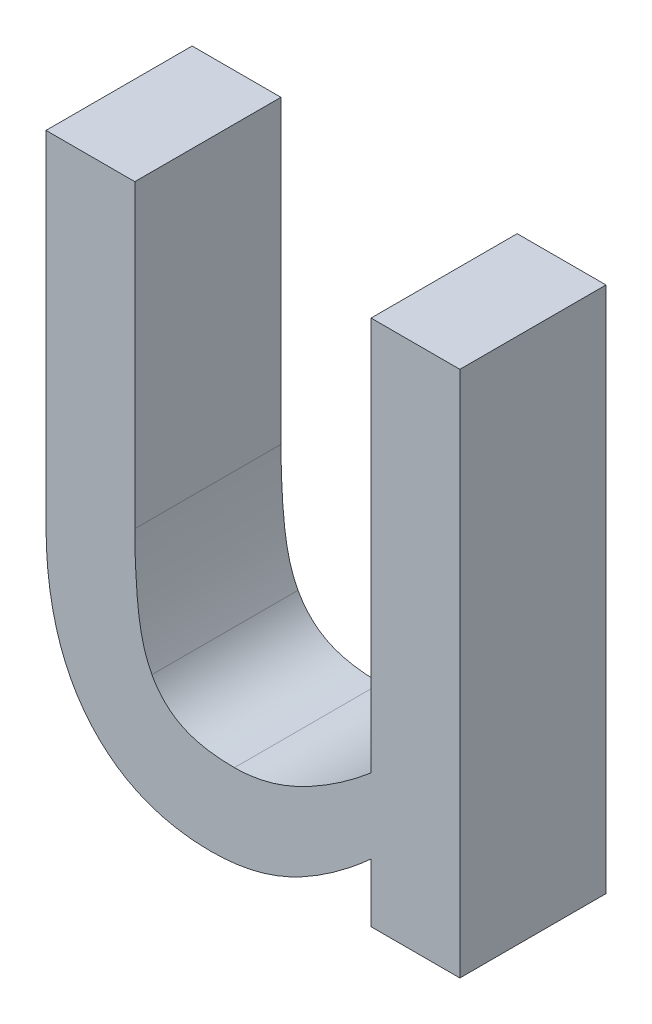
ISO-10303-21;
HEADER;
FILE_DESCRIPTION(('STEP AP214'),'2;1');
FILE_NAME('part.step','',(''),(''),'','','');
FILE_SCHEMA(('AUTOMOTIVE_DESIGN { 1 0 10303 214 1 1 1 1 }'));
ENDSEC;
DATA;
#1=APPLICATION_CONTEXT('core data for automotive mechanical design processes');
#2=APPLICATION_PROTOCOL_DEFINITION('international standard','automotive_design',2000,#1);
#3=PRODUCT_CONTEXT('',#1,'mechanical');
#4=PRODUCT('Part','Part','',(#3));
#5=PRODUCT_RELATED_PRODUCT_CATEGORY('part','',(#4));
#6=PRODUCT_DEFINITION_FORMATION('','',#4);
#7=PRODUCT_DEFINITION_CONTEXT('part definition',#1,'design');
#8=PRODUCT_DEFINITION('design','',#6,#7);
#9=PRODUCT_DEFINITION_SHAPE('','',#8);
#10=(LENGTH_UNIT() NAMED_UNIT(*) SI_UNIT(.MILLI.,.METRE.));
#11=(NAMED_UNIT(*) PLANE_ANGLE_UNIT() SI_UNIT($,.RADIAN.));
#12=(NAMED_UNIT(*) SI_UNIT($,.STERADIAN.) SOLID_ANGLE_UNIT());
#13=UNCERTAINTY_MEASURE_WITH_UNIT(LENGTH_MEASURE(1.E-05),#10,'distance_accuracy_value','');
#14=(GEOMETRIC_REPRESENTATION_CONTEXT(3) GLOBAL_UNCERTAINTY_ASSIGNED_CONTEXT((#13)) GLOBAL_UNIT_ASSIGNED_CONTEXT((#10,
#11,#12)) REPRESENTATION_CONTEXT('',''));
#15=CARTESIAN_POINT('',(0.,0.,0.));
#16=DIRECTION('',(0.,0.,1.));
#17=DIRECTION('',(1.,0.,0.));
#18=AXIS2_PLACEMENT_3D('',#15,#16,#17);
#19=CARTESIAN_POINT('',(-9.781230985172,-7.71259238677,0.));
#20=DIRECTION('',(1.,0.,0.));
#21=DIRECTION('',(0.,1.,0.));
#22=AXIS2_PLACEMENT_3D('',#19,#20,#21);
#23=PLANE('',#22);
#24=DIRECTION('',(0.,-1.,0.));
#25=VECTOR('',#24,1.);
#26=CARTESIAN_POINT('',(-9.781230985172,-7.506899475119,0.));
#27=LINE('',#26,#25);
#28=CARTESIAN_POINT('',(-9.781230985172,-7.506899475119,0.));
#29=VERTEX_POINT('',#28);
#30=CARTESIAN_POINT('',(-9.781230985172,-7.71259238677,0.));
#31=VERTEX_POINT('',#30);
#32=EDGE_CURVE('E11',#29,#31,#27,.T.);
#33=ORIENTED_EDGE('',*,*,#32,.F.);
#34=DIRECTION('',(0.,0.,1.));
#35=VECTOR('',#34,1.);
#36=CARTESIAN_POINT('',(-9.781230985172,-7.506899475119,0.));
#37=LINE('',#36,#35);
#38=CARTESIAN_POINT('',(-9.781230985172,-7.506899475119,0.1));
#39=VERTEX_POINT('',#38);
#40=EDGE_CURVE('E24',#29,#39,#37,.T.);
#41=ORIENTED_EDGE('',*,*,#40,.T.);
#42=DIRECTION('',(0.,1.,0.));
#43=VECTOR('',#42,1.);
#44=CARTESIAN_POINT('',(-9.781230985172,-7.506899475119,0.1));
#45=LINE('',#44,#43);
#46=CARTESIAN_POINT('',(-9.781230985172,-7.71259238677,0.1));
#47=VERTEX_POINT('',#46);
#48=EDGE_CURVE('E130',#47,#39,#45,.T.);
#49=ORIENTED_EDGE('',*,*,#48,.F.);
#50=DIRECTION('',(0.,0.,1.));
#51=VECTOR('',#50,1.);
#52=CARTESIAN_POINT('',(-9.781230985172,-7.71259238677,0.));
#53=LINE('',#52,#51);
#54=EDGE_CURVE('E258',#31,#47,#53,.T.);
#55=ORIENTED_EDGE('',*,*,#54,.F.);
#56=EDGE_LOOP('',(#33,#41,#49,#55));
#57=FACE_BOUND('',#56,.T.);
#58=ADVANCED_FACE('F17',(#57),#23,.T.);
#59=CARTESIAN_POINT('',(-9.769543887919,-7.793233357814,0.));
#60=CARTESIAN_POINT('',(-9.769543887919,-7.793233357814,0.1));
#61=CARTESIAN_POINT('',(-9.77655614627,-7.780377550836,0.));
#62=CARTESIAN_POINT('',(-9.77655614627,-7.780377550836,0.1));
#63=CARTESIAN_POINT('',(-9.781230985172,-7.737524860909,0.));
#64=CARTESIAN_POINT('',(-9.781230985172,-7.737524860909,0.1));
#65=CARTESIAN_POINT('',(-9.781230985172,-7.71259238677,0.));
#66=CARTESIAN_POINT('',(-9.781230985172,-7.71259238677,0.1));
#67=B_SPLINE_SURFACE_WITH_KNOTS('',2,1,((#59,#60),(#61,#62),(#63,#64),(#65,#66)),.UNSPECIFIED.,
.F.,.F.,.F.,(3,1,3),(2,2),(-2.,-1.,0.),(0.,0.01),.UNSPECIFIED.);
#68=CARTESIAN_POINT('',(-9.781230985172,-7.71259238677,0.));
#69=CARTESIAN_POINT('',(-9.781230985172,-7.737524860909,0.));
#70=CARTESIAN_POINT('',(-9.77655614627,-7.780377550836,0.));
#71=CARTESIAN_POINT('',(-9.769543887919,-7.793233357814,0.));
#72=B_SPLINE_CURVE_WITH_KNOTS('',2,(#68,#69,#70,#71),.UNSPECIFIED.,.F.,.F.,(3,1,3),(0.,1.,2.),.UNSPECIFIED.);
#73=CARTESIAN_POINT('',(-9.769543887919,-7.793233357814,0.));
#74=VERTEX_POINT('',#73);
#75=EDGE_CURVE('E251',#31,#74,#72,.T.);
#76=CARTESIAN_POINT('',(-9.769543887919,-7.793233357814,0.1));
#77=CARTESIAN_POINT('',(-9.77655614627,-7.780377550836,0.1));
#78=CARTESIAN_POINT('',(-9.781230985172,-7.737524860909,0.1));
#79=CARTESIAN_POINT('',(-9.781230985172,-7.71259238677,0.1));
#80=B_SPLINE_CURVE_WITH_KNOTS('',2,(#76,#77,#78,#79),.UNSPECIFIED.,.F.,.F.,(3,1,3),(-2.,-1.,0.),.UNSPECIFIED.);
#81=CARTESIAN_POINT('',(-9.769543887919,-7.793233357814,0.1));
#82=VERTEX_POINT('',#81);
#83=EDGE_CURVE('E247',#82,#47,#80,.T.);
#84=DIRECTION('',(0.,0.,1.));
#85=VECTOR('',#84,1.);
#86=CARTESIAN_POINT('',(-9.769543887919,-7.793233357814,0.));
#87=LINE('',#86,#85);
#88=EDGE_CURVE('E241',#74,#82,#87,.T.);
#89=ORIENTED_EDGE('',*,*,#75,.F.);
#90=ORIENTED_EDGE('',*,*,#54,.T.);
#91=ORIENTED_EDGE('',*,*,#83,.F.);
#92=ORIENTED_EDGE('',*,*,#88,.F.);
#93=EDGE_LOOP('',(#89,#90,#91,#92));
#94=FACE_BOUND('',#93,.T.);
#95=ADVANCED_FACE('F303',(#94),#67,.T.);
#96=CARTESIAN_POINT('',(-9.713056251197,-7.820113681496,0.));
#97=CARTESIAN_POINT('',(-9.713056251197,-7.820113681496,0.1));
#98=CARTESIAN_POINT('',(-9.735651305885,-7.820113681496,0.));
#99=CARTESIAN_POINT('',(-9.735651305885,-7.820113681496,0.1));
#100=CARTESIAN_POINT('',(-9.762142059659,-7.806868304609,0.));
#101=CARTESIAN_POINT('',(-9.762142059659,-7.806868304609,0.1));
#102=CARTESIAN_POINT('',(-9.769543887919,-7.793233357814,0.));
#103=CARTESIAN_POINT('',(-9.769543887919,-7.793233357814,0.1));
#104=B_SPLINE_SURFACE_WITH_KNOTS('',2,1,((#96,#97),(#98,#99),(#100,#101),(#102,#103)),
.UNSPECIFIED.,.F.,.F.,.F.,(3,1,3),(2,2),(-2.,-1.,0.),(0.,0.01),.UNSPECIFIED.);
#105=CARTESIAN_POINT('',(-9.769543887919,-7.793233357814,0.));
#106=CARTESIAN_POINT('',(-9.762142059659,-7.806868304609,0.));
#107=CARTESIAN_POINT('',(-9.735651305885,-7.820113681496,0.));
#108=CARTESIAN_POINT('',(-9.713056251197,-7.820113681496,0.));
#109=B_SPLINE_CURVE_WITH_KNOTS('',2,(#105,#106,#107,#108),.UNSPECIFIED.,.F.,.F.,(3,1,3),(0.,1.,
2.),.UNSPECIFIED.);
#110=CARTESIAN_POINT('',(-9.713056251197,-7.820113681496,0.));
#111=VERTEX_POINT('',#110);
#112=EDGE_CURVE('E234',#74,#111,#109,.T.);
#113=CARTESIAN_POINT('',(-9.713056251197,-7.820113681496,0.1));
#114=CARTESIAN_POINT('',(-9.735651305885,-7.820113681496,0.1));
#115=CARTESIAN_POINT('',(-9.762142059659,-7.806868304609,0.1));
#116=CARTESIAN_POINT('',(-9.769543887919,-7.793233357814,0.1));
#117=B_SPLINE_CURVE_WITH_KNOTS('',2,(#113,#114,#115,#116),.UNSPECIFIED.,.F.,.F.,(3,1,3),(-2.,
-1.,0.),.UNSPECIFIED.);
#118=CARTESIAN_POINT('',(-9.713056251197,-7.820113681496,0.1));
#119=VERTEX_POINT('',#118);
#120=EDGE_CURVE('E229',#119,#82,#117,.T.);
#121=DIRECTION('',(0.,0.,1.));
#122=VECTOR('',#121,1.);
#123=CARTESIAN_POINT('',(-9.713056251197,-7.820113681496,0.));
#124=LINE('',#123,#122);
#125=EDGE_CURVE('E223',#111,#119,#124,.T.);
#126=ORIENTED_EDGE('',*,*,#112,.F.);
#127=ORIENTED_EDGE('',*,*,#88,.T.);
#128=ORIENTED_EDGE('',*,*,#120,.F.);
#129=ORIENTED_EDGE('',*,*,#125,.F.);
#130=EDGE_LOOP('',(#126,#127,#128,#129));
#131=FACE_BOUND('',#130,.T.);
#132=ADVANCED_FACE('F299',(#131),#104,.T.);
#133=CARTESIAN_POINT('',(-9.619559473174,-7.776481851752,0.));
#134=CARTESIAN_POINT('',(-9.619559473174,-7.776481851752,0.1));
#135=CARTESIAN_POINT('',(-9.642544097771,-7.795960347173,0.));
#136=CARTESIAN_POINT('',(-9.642544097771,-7.795960347173,0.1));
#137=CARTESIAN_POINT('',(-9.690461196508,-7.820113681496,0.));
#138=CARTESIAN_POINT('',(-9.690461196508,-7.820113681496,0.1));
#139=CARTESIAN_POINT('',(-9.713056251197,-7.820113681496,0.));
#140=CARTESIAN_POINT('',(-9.713056251197,-7.820113681496,0.1));
#141=B_SPLINE_SURFACE_WITH_KNOTS('',2,1,((#133,#134),(#135,#136),(#137,#138),(#139,#140)),
.UNSPECIFIED.,.F.,.F.,.F.,(3,1,3),(2,2),(-2.,-1.,0.),(0.,0.01),.UNSPECIFIED.);
#142=CARTESIAN_POINT('',(-9.713056251197,-7.820113681496,0.));
#143=CARTESIAN_POINT('',(-9.690461196508,-7.820113681496,0.));
#144=CARTESIAN_POINT('',(-9.642544097771,-7.795960347173,0.));
#145=CARTESIAN_POINT('',(-9.619559473174,-7.776481851752,0.));
#146=B_SPLINE_CURVE_WITH_KNOTS('',2,(#142,#143,#144,#145),.UNSPECIFIED.,.F.,.F.,(3,1,3),(0.,1.,
2.),.UNSPECIFIED.);
#147=CARTESIAN_POINT('',(-9.619559473174,-7.776481851752,0.));
#148=VERTEX_POINT('',#147);
#149=EDGE_CURVE('E216',#111,#148,#146,.T.);
#150=CARTESIAN_POINT('',(-9.619559473174,-7.776481851752,0.1));
#151=CARTESIAN_POINT('',(-9.642544097771,-7.795960347173,0.1));
#152=CARTESIAN_POINT('',(-9.690461196508,-7.820113681496,0.1));
#153=CARTESIAN_POINT('',(-9.713056251197,-7.820113681496,0.1));
#154=B_SPLINE_CURVE_WITH_KNOTS('',2,(#150,#151,#152,#153),.UNSPECIFIED.,.F.,.F.,(3,1,3),(-2.,
-1.,0.),.UNSPECIFIED.);
#155=CARTESIAN_POINT('',(-9.619559473174,-7.776481851752,0.1));
#156=VERTEX_POINT('',#155);
#157=EDGE_CURVE('E211',#156,#119,#154,.T.);
#158=DIRECTION('',(0.,0.,1.));
#159=VECTOR('',#158,1.);
#160=CARTESIAN_POINT('',(-9.619559473174,-7.776481851752,0.));
#161=LINE('',#160,#159);
#162=EDGE_CURVE('E208',#148,#156,#161,.T.);
#163=ORIENTED_EDGE('',*,*,#149,.F.);
#164=ORIENTED_EDGE('',*,*,#125,.T.);
#165=ORIENTED_EDGE('',*,*,#157,.F.);
#166=ORIENTED_EDGE('',*,*,#162,.F.);
#167=EDGE_LOOP('',(#163,#164,#165,#166));
#168=FACE_BOUND('',#167,.T.);
#169=ADVANCED_FACE('F295',(#168),#141,.T.);
#170=CARTESIAN_POINT('',(-9.619559473174,-7.506899475119,0.));
#171=DIRECTION('',(-1.,0.,0.));
#172=DIRECTION('',(0.,-1.,0.));
#173=AXIS2_PLACEMENT_3D('',#170,#171,#172);
#174=PLANE('',#173);
#175=DIRECTION('',(0.,1.,0.));
#176=VECTOR('',#175,1.);
#177=CARTESIAN_POINT('',(-9.619559473174,-7.776481851752,0.));
#178=LINE('',#177,#176);
#179=CARTESIAN_POINT('',(-9.619559473174,-7.506899475119,0.));
#180=VERTEX_POINT('',#179);
#181=EDGE_CURVE('E206',#148,#180,#178,.T.);
#182=ORIENTED_EDGE('',*,*,#181,.F.);
#183=ORIENTED_EDGE('',*,*,#162,.T.);
#184=DIRECTION('',(0.,-1.,0.));
#185=VECTOR('',#184,1.);
#186=CARTESIAN_POINT('',(-9.619559473174,-7.776481851752,0.1));
#187=LINE('',#186,#185);
#188=CARTESIAN_POINT('',(-9.619559473174,-7.506899475119,0.1));
#189=VERTEX_POINT('',#188);
#190=EDGE_CURVE('E203',#189,#156,#187,.T.);
#191=ORIENTED_EDGE('',*,*,#190,.F.);
#192=DIRECTION('',(0.,0.,1.));
#193=VECTOR('',#192,1.);
#194=CARTESIAN_POINT('',(-9.619559473174,-7.506899475119,0.));
#195=LINE('',#194,#193);
#196=EDGE_CURVE('E200',#180,#189,#195,.T.);
#197=ORIENTED_EDGE('',*,*,#196,.F.);
#198=EDGE_LOOP('',(#182,#183,#191,#197));
#199=FACE_BOUND('',#198,.T.);
#200=ADVANCED_FACE('F291',(#199),#174,.T.);
#201=CARTESIAN_POINT('',(-9.558786567459,-7.506899475119,0.));
#202=DIRECTION('',(0.,1.,0.));
#203=DIRECTION('',(-1.,0.,0.));
#204=AXIS2_PLACEMENT_3D('',#201,#202,#203);
#205=PLANE('',#204);
#206=DIRECTION('',(1.,0.,0.));
#207=VECTOR('',#206,1.);
#208=CARTESIAN_POINT('',(-9.619559473174,-7.506899475119,0.));
#209=LINE('',#208,#207);
#210=CARTESIAN_POINT('',(-9.558786567459,-7.506899475119,0.));
#211=VERTEX_POINT('',#210);
#212=EDGE_CURVE('E198',#180,#211,#209,.T.);
#213=ORIENTED_EDGE('',*,*,#212,.F.);
#214=ORIENTED_EDGE('',*,*,#196,.T.);
#215=DIRECTION('',(-1.,0.,0.));
#216=VECTOR('',#215,1.);
#217=CARTESIAN_POINT('',(-9.619559473174,-7.506899475119,0.1));
#218=LINE('',#217,#216);
#219=CARTESIAN_POINT('',(-9.558786567459,-7.506899475119,0.1));
#220=VERTEX_POINT('',#219);
#221=EDGE_CURVE('E195',#220,#189,#218,.T.);
#222=ORIENTED_EDGE('',*,*,#221,.F.);
#223=DIRECTION('',(0.,0.,1.));
#224=VECTOR('',#223,1.);
#225=CARTESIAN_POINT('',(-9.558786567459,-7.506899475119,0.));
#226=LINE('',#225,#224);
#227=EDGE_CURVE('E192',#211,#220,#226,.T.);
#228=ORIENTED_EDGE('',*,*,#227,.F.);
#229=EDGE_LOOP('',(#213,#214,#222,#228));
#230=FACE_BOUND('',#229,.T.);
#231=ADVANCED_FACE('F287',(#230),#205,.T.);
#232=CARTESIAN_POINT('',(-9.558786567459,-7.867641210324,0.));
#233=DIRECTION('',(1.,0.,0.));
#234=DIRECTION('',(0.,1.,0.));
#235=AXIS2_PLACEMENT_3D('',#232,#233,#234);
#236=PLANE('',#235);
#237=DIRECTION('',(0.,-1.,0.));
#238=VECTOR('',#237,1.);
#239=CARTESIAN_POINT('',(-9.558786567459,-7.506899475119,0.));
#240=LINE('',#239,#238);
#241=CARTESIAN_POINT('',(-9.558786567459,-7.867641210324,0.));
#242=VERTEX_POINT('',#241);
#243=EDGE_CURVE('E190',#211,#242,#240,.T.);
#244=ORIENTED_EDGE('',*,*,#243,.F.);
#245=ORIENTED_EDGE('',*,*,#227,.T.);
#246=DIRECTION('',(0.,1.,0.));
#247=VECTOR('',#246,1.);
#248=CARTESIAN_POINT('',(-9.558786567459,-7.506899475119,0.1));
#249=LINE('',#248,#247);
#250=CARTESIAN_POINT('',(-9.558786567459,-7.867641210324,0.1));
#251=VERTEX_POINT('',#250);
#252=EDGE_CURVE('E187',#251,#220,#249,.T.);
#253=ORIENTED_EDGE('',*,*,#252,.F.);
#254=DIRECTION('',(0.,0.,1.));
#255=VECTOR('',#254,1.);
#256=CARTESIAN_POINT('',(-9.558786567459,-7.867641210324,0.));
#257=LINE('',#256,#255);
#258=EDGE_CURVE('E184',#242,#251,#257,.T.);
#259=ORIENTED_EDGE('',*,*,#258,.F.);
#260=EDGE_LOOP('',(#244,#245,#253,#259));
#261=FACE_BOUND('',#260,.T.);
#262=ADVANCED_FACE('F283',(#261),#236,.T.);
#263=CARTESIAN_POINT('',(-9.619559473174,-7.867641210324,0.));
#264=DIRECTION('',(0.,-1.,0.));
#265=DIRECTION('',(1.,0.,0.));
#266=AXIS2_PLACEMENT_3D('',#263,#264,#265);
#267=PLANE('',#266);
#268=DIRECTION('',(-1.,0.,0.));
#269=VECTOR('',#268,1.);
#270=CARTESIAN_POINT('',(-9.558786567459,-7.867641210324,0.));
#271=LINE('',#270,#269);
#272=CARTESIAN_POINT('',(-9.619559473174,-7.867641210324,0.));
#273=VERTEX_POINT('',#272);
#274=EDGE_CURVE('E182',#242,#273,#271,.T.);
#275=ORIENTED_EDGE('',*,*,#274,.F.);
#276=ORIENTED_EDGE('',*,*,#258,.T.);
#277=DIRECTION('',(1.,0.,0.));
#278=VECTOR('',#277,1.);
#279=CARTESIAN_POINT('',(-9.558786567459,-7.867641210324,0.1));
#280=LINE('',#279,#278);
#281=CARTESIAN_POINT('',(-9.619559473174,-7.867641210324,0.1));
#282=VERTEX_POINT('',#281);
#283=EDGE_CURVE('E179',#282,#251,#280,.T.);
#284=ORIENTED_EDGE('',*,*,#283,.F.);
#285=DIRECTION('',(0.,0.,1.));
#286=VECTOR('',#285,1.);
#287=CARTESIAN_POINT('',(-9.619559473174,-7.867641210324,0.));
#288=LINE('',#287,#286);
#289=EDGE_CURVE('E176',#273,#282,#288,.T.);
#290=ORIENTED_EDGE('',*,*,#289,.F.);
#291=EDGE_LOOP('',(#275,#276,#284,#290));
#292=FACE_BOUND('',#291,.T.);
#293=ADVANCED_FACE('F279',(#292),#267,.T.);
#294=CARTESIAN_POINT('',(-9.619559473174,-7.827515509756,0.));
#295=DIRECTION('',(-1.,0.,0.));
#296=DIRECTION('',(0.,-1.,0.));
#297=AXIS2_PLACEMENT_3D('',#294,#295,#296);
#298=PLANE('',#297);
#299=DIRECTION('',(0.,1.,0.));
#300=VECTOR('',#299,1.);
#301=CARTESIAN_POINT('',(-9.619559473174,-7.867641210324,0.));
#302=LINE('',#301,#300);
#303=CARTESIAN_POINT('',(-9.619559473174,-7.827515509756,0.));
#304=VERTEX_POINT('',#303);
#305=EDGE_CURVE('E174',#273,#304,#302,.T.);
#306=ORIENTED_EDGE('',*,*,#305,.F.);
#307=ORIENTED_EDGE('',*,*,#289,.T.);
#308=DIRECTION('',(0.,-1.,0.));
#309=VECTOR('',#308,1.);
#310=CARTESIAN_POINT('',(-9.619559473174,-7.867641210324,0.1));
#311=LINE('',#310,#309);
#312=CARTESIAN_POINT('',(-9.619559473174,-7.827515509756,0.1));
#313=VERTEX_POINT('',#312);
#314=EDGE_CURVE('E171',#313,#282,#311,.T.);
#315=ORIENTED_EDGE('',*,*,#314,.F.);
#316=DIRECTION('',(0.,0.,1.));
#317=VECTOR('',#316,1.);
#318=CARTESIAN_POINT('',(-9.619559473174,-7.827515509756,0.));
#319=LINE('',#318,#317);
#320=EDGE_CURVE('E165',#304,#313,#319,.T.);
#321=ORIENTED_EDGE('',*,*,#320,.F.);
#322=EDGE_LOOP('',(#306,#307,#315,#321));
#323=FACE_BOUND('',#322,.T.);
#324=ADVANCED_FACE('F275',(#323),#298,.T.);
#325=CARTESIAN_POINT('',(-9.729028617442,-7.877770027944,0.));
#326=CARTESIAN_POINT('',(-9.729028617442,-7.877770027944,0.1));
#327=CARTESIAN_POINT('',(-9.699421304402,-7.877770027944,0.));
#328=CARTESIAN_POINT('',(-9.699421304402,-7.877770027944,0.1));
#329=CARTESIAN_POINT('',(-9.646829366764,-7.852058413987,0.));
#330=CARTESIAN_POINT('',(-9.646829366764,-7.852058413987,0.1));
#331=CARTESIAN_POINT('',(-9.619559473174,-7.827515509756,0.));
#332=CARTESIAN_POINT('',(-9.619559473174,-7.827515509756,0.1));
#333=B_SPLINE_SURFACE_WITH_KNOTS('',2,1,((#325,#326),(#327,#328),(#329,#330),(#331,#332)),
.UNSPECIFIED.,.F.,.F.,.F.,(3,1,3),(2,2),(-2.,-1.,0.),(0.,0.01),.UNSPECIFIED.);
#334=CARTESIAN_POINT('',(-9.619559473174,-7.827515509756,0.));
#335=CARTESIAN_POINT('',(-9.646829366764,-7.852058413987,0.));
#336=CARTESIAN_POINT('',(-9.699421304402,-7.877770027944,0.));
#337=CARTESIAN_POINT('',(-9.729028617442,-7.877770027944,0.));
#338=B_SPLINE_CURVE_WITH_KNOTS('',2,(#334,#335,#336,#337),.UNSPECIFIED.,.F.,.F.,(3,1,3),(0.,1.,
2.),.UNSPECIFIED.);
#339=CARTESIAN_POINT('',(-9.729028617442,-7.877770027944,0.));
#340=VERTEX_POINT('',#339);
#341=EDGE_CURVE('E158',#304,#340,#338,.T.);
#342=CARTESIAN_POINT('',(-9.729028617442,-7.877770027944,0.1));
#343=CARTESIAN_POINT('',(-9.699421304402,-7.877770027944,0.1));
#344=CARTESIAN_POINT('',(-9.646829366764,-7.852058413987,0.1));
#345=CARTESIAN_POINT('',(-9.619559473174,-7.827515509756,0.1));
#346=B_SPLINE_CURVE_WITH_KNOTS('',2,(#342,#343,#344,#345),.UNSPECIFIED.,.F.,.F.,(3,1,3),(-2.,
-1.,0.),.UNSPECIFIED.);
#347=CARTESIAN_POINT('',(-9.729028617442,-7.877770027944,0.1));
#348=VERTEX_POINT('',#347);
#349=EDGE_CURVE('E153',#348,#313,#346,.T.);
#350=DIRECTION('',(0.,0.,1.));
#351=VECTOR('',#350,1.);
#352=CARTESIAN_POINT('',(-9.729028617442,-7.877770027944,0.));
#353=LINE('',#352,#351);
#354=EDGE_CURVE('E147',#340,#348,#353,.T.);
#355=ORIENTED_EDGE('',*,*,#341,.F.);
#356=ORIENTED_EDGE('',*,*,#320,.T.);
#357=ORIENTED_EDGE('',*,*,#349,.F.);
#358=ORIENTED_EDGE('',*,*,#354,.F.);
#359=EDGE_LOOP('',(#355,#356,#357,#358));
#360=FACE_BOUND('',#359,.T.);
#361=ADVANCED_FACE('F271',(#360),#333,.T.);
#362=CARTESIAN_POINT('',(-9.842003890886,-7.741030990085,0.));
#363=CARTESIAN_POINT('',(-9.842003890886,-7.741030990085,0.1));
#364=CARTESIAN_POINT('',(-9.842003890886,-7.807647444426,0.));
#365=CARTESIAN_POINT('',(-9.842003890886,-7.807647444426,0.1));
#366=CARTESIAN_POINT('',(-9.782010124988,-7.877770027944,0.));
#367=CARTESIAN_POINT('',(-9.782010124988,-7.877770027944,0.1));
#368=CARTESIAN_POINT('',(-9.729028617442,-7.877770027944,0.));
#369=CARTESIAN_POINT('',(-9.729028617442,-7.877770027944,0.1));
#370=B_SPLINE_SURFACE_WITH_KNOTS('',2,1,((#362,#363),(#364,#365),(#366,#367),(#368,#369)),
.UNSPECIFIED.,.F.,.F.,.F.,(3,1,3),(2,2),(-2.,-1.,0.),(0.,0.01),.UNSPECIFIED.);
#371=CARTESIAN_POINT('',(-9.729028617442,-7.877770027944,0.));
#372=CARTESIAN_POINT('',(-9.782010124988,-7.877770027944,0.));
#373=CARTESIAN_POINT('',(-9.842003890886,-7.807647444426,0.));
#374=CARTESIAN_POINT('',(-9.842003890886,-7.741030990085,0.));
#375=B_SPLINE_CURVE_WITH_KNOTS('',2,(#371,#372,#373,#374),.UNSPECIFIED.,.F.,.F.,(3,1,3),(0.,1.,
2.),.UNSPECIFIED.);
#376=CARTESIAN_POINT('',(-9.842003890886,-7.741030990085,0.));
#377=VERTEX_POINT('',#376);
#378=EDGE_CURVE('E140',#340,#377,#375,.T.);
#379=CARTESIAN_POINT('',(-9.842003890886,-7.741030990085,0.1));
#380=CARTESIAN_POINT('',(-9.842003890886,-7.807647444426,0.1));
#381=CARTESIAN_POINT('',(-9.782010124988,-7.877770027944,0.1));
#382=CARTESIAN_POINT('',(-9.729028617442,-7.877770027944,0.1));
#383=B_SPLINE_CURVE_WITH_KNOTS('',2,(#379,#380,#381,#382),.UNSPECIFIED.,.F.,.F.,(3,1,3),(-2.,
-1.,0.),.UNSPECIFIED.);
#384=CARTESIAN_POINT('',(-9.842003890886,-7.741030990085,0.1));
#385=VERTEX_POINT('',#384);
#386=EDGE_CURVE('E136',#385,#348,#383,.T.);
#387=DIRECTION('',(0.,0.,1.));
#388=VECTOR('',#387,1.);
#389=CARTESIAN_POINT('',(-9.842003890886,-7.741030990085,0.));
#390=LINE('',#389,#388);
#391=EDGE_CURVE('E115',#377,#385,#390,.T.);
#392=ORIENTED_EDGE('',*,*,#378,.F.);
#393=ORIENTED_EDGE('',*,*,#354,.T.);
#394=ORIENTED_EDGE('',*,*,#386,.F.);
#395=ORIENTED_EDGE('',*,*,#391,.F.);
#396=EDGE_LOOP('',(#392,#393,#394,#395));
#397=FACE_BOUND('',#396,.T.);
#398=ADVANCED_FACE('F269',(#397),#370,.T.);
#399=CARTESIAN_POINT('',(-9.842003890886,-7.506899475119,0.));
#400=DIRECTION('',(-1.,0.,0.));
#401=DIRECTION('',(0.,-1.,0.));
#402=AXIS2_PLACEMENT_3D('',#399,#400,#401);
#403=PLANE('',#402);
#404=DIRECTION('',(0.,1.,0.));
#405=VECTOR('',#404,1.);
#406=CARTESIAN_POINT('',(-9.842003890886,-7.741030990085,0.));
#407=LINE('',#406,#405);
#408=CARTESIAN_POINT('',(-9.842003890886,-7.506899475119,0.));
#409=VERTEX_POINT('',#408);
#410=EDGE_CURVE('E119',#377,#409,#407,.T.);
#411=ORIENTED_EDGE('',*,*,#410,.F.);
#412=ORIENTED_EDGE('',*,*,#391,.T.);
#413=DIRECTION('',(0.,-1.,0.));
#414=VECTOR('',#413,1.);
#415=CARTESIAN_POINT('',(-9.842003890886,-7.741030990085,0.1));
#416=LINE('',#415,#414);
#417=CARTESIAN_POINT('',(-9.842003890886,-7.506899475119,0.1));
#418=VERTEX_POINT('',#417);
#419=EDGE_CURVE('E108',#418,#385,#416,.T.);
#420=ORIENTED_EDGE('',*,*,#419,.F.);
#421=DIRECTION('',(0.,0.,1.));
#422=VECTOR('',#421,1.);
#423=CARTESIAN_POINT('',(-9.842003890886,-7.506899475119,0.));
#424=LINE('',#423,#422);
#425=EDGE_CURVE('E112',#409,#418,#424,.T.);
#426=ORIENTED_EDGE('',*,*,#425,.F.);
#427=EDGE_LOOP('',(#411,#412,#420,#426));
#428=FACE_BOUND('',#427,.T.);
#429=ADVANCED_FACE('F111',(#428),#403,.T.);
#430=CARTESIAN_POINT('',(-9.781230985172,-7.506899475119,0.));
#431=DIRECTION('',(0.,1.,0.));
#432=DIRECTION('',(-1.,0.,0.));
#433=AXIS2_PLACEMENT_3D('',#430,#431,#432);
#434=PLANE('',#433);
#435=DIRECTION('',(1.,0.,0.));
#436=VECTOR('',#435,1.);
#437=CARTESIAN_POINT('',(-9.842003890886,-7.506899475119,0.));
#438=LINE('',#437,#436);
#439=EDGE_CURVE('E125',#409,#29,#438,.T.);
#440=ORIENTED_EDGE('',*,*,#439,.F.);
#441=ORIENTED_EDGE('',*,*,#425,.T.);
#442=DIRECTION('',(-1.,0.,0.));
#443=VECTOR('',#442,1.);
#444=CARTESIAN_POINT('',(-9.842003890886,-7.506899475119,0.1));
#445=LINE('',#444,#443);
#446=EDGE_CURVE('E124',#39,#418,#445,.T.);
#447=ORIENTED_EDGE('',*,*,#446,.F.);
#448=ORIENTED_EDGE('',*,*,#40,.F.);
#449=EDGE_LOOP('',(#440,#441,#447,#448));
#450=FACE_BOUND('',#449,.T.);
#451=ADVANCED_FACE('F123',(#450),#434,.T.);
#452=CARTESIAN_POINT('',(-9.691221779849,-7.692481479861,0.));
#453=DIRECTION('',(0.,0.,1.));
#454=DIRECTION('',(1.,0.,0.));
#455=AXIS2_PLACEMENT_3D('',#452,#453,#454);
#456=PLANE('',#455);
#457=ORIENTED_EDGE('',*,*,#439,.T.);
#458=ORIENTED_EDGE('',*,*,#32,.T.);
#459=ORIENTED_EDGE('',*,*,#75,.T.);
#460=ORIENTED_EDGE('',*,*,#112,.T.);
#461=ORIENTED_EDGE('',*,*,#149,.T.);
#462=ORIENTED_EDGE('',*,*,#181,.T.);
#463=ORIENTED_EDGE('',*,*,#212,.T.);
#464=ORIENTED_EDGE('',*,*,#243,.T.);
#465=ORIENTED_EDGE('',*,*,#274,.T.);
#466=ORIENTED_EDGE('',*,*,#305,.T.);
#467=ORIENTED_EDGE('',*,*,#341,.T.);
#468=ORIENTED_EDGE('',*,*,#378,.T.);
#469=ORIENTED_EDGE('',*,*,#410,.T.);
#470=EDGE_LOOP('',(#457,#458,#459,#460,#461,#462,#463,#464,#465,#466,#467,#468,#469));
#471=FACE_BOUND('',#470,.T.);
#472=ADVANCED_FACE('F264',(#471),#456,.F.);
#473=CARTESIAN_POINT('',(-9.691221779849,-7.692481479861,0.1));
#474=DIRECTION('',(0.,0.,1.));
#475=DIRECTION('',(1.,0.,0.));
#476=AXIS2_PLACEMENT_3D('',#473,#474,#475);
#477=PLANE('',#476);
#478=ORIENTED_EDGE('',*,*,#446,.T.);
#479=ORIENTED_EDGE('',*,*,#419,.T.);
#480=ORIENTED_EDGE('',*,*,#386,.T.);
#481=ORIENTED_EDGE('',*,*,#349,.T.);
#482=ORIENTED_EDGE('',*,*,#314,.T.);
#483=ORIENTED_EDGE('',*,*,#283,.T.);
#484=ORIENTED_EDGE('',*,*,#252,.T.);
#485=ORIENTED_EDGE('',*,*,#221,.T.);
#486=ORIENTED_EDGE('',*,*,#190,.T.);
#487=ORIENTED_EDGE('',*,*,#157,.T.);
#488=ORIENTED_EDGE('',*,*,#120,.T.);
#489=ORIENTED_EDGE('',*,*,#83,.T.);
#490=ORIENTED_EDGE('',*,*,#48,.T.);
#491=EDGE_LOOP('',(#478,#479,#480,#481,#482,#483,#484,#485,#486,#487,#488,#489,#490));
#492=FACE_BOUND('',#491,.T.);
#493=ADVANCED_FACE('F128',(#492),#477,.T.);
#494=CLOSED_SHELL('',(#58,#95,#132,#169,#200,#231,#262,#293,#324,#361,#398,#429,#451,#472,#493));
#495=MANIFOLD_SOLID_BREP('B1',#494);
#496=ADVANCED_BREP_SHAPE_REPRESENTATION('',(#18,#495),#14);
#497=SHAPE_DEFINITION_REPRESENTATION(#9,#496);
ENDSEC;
END-ISO-10303-21;
